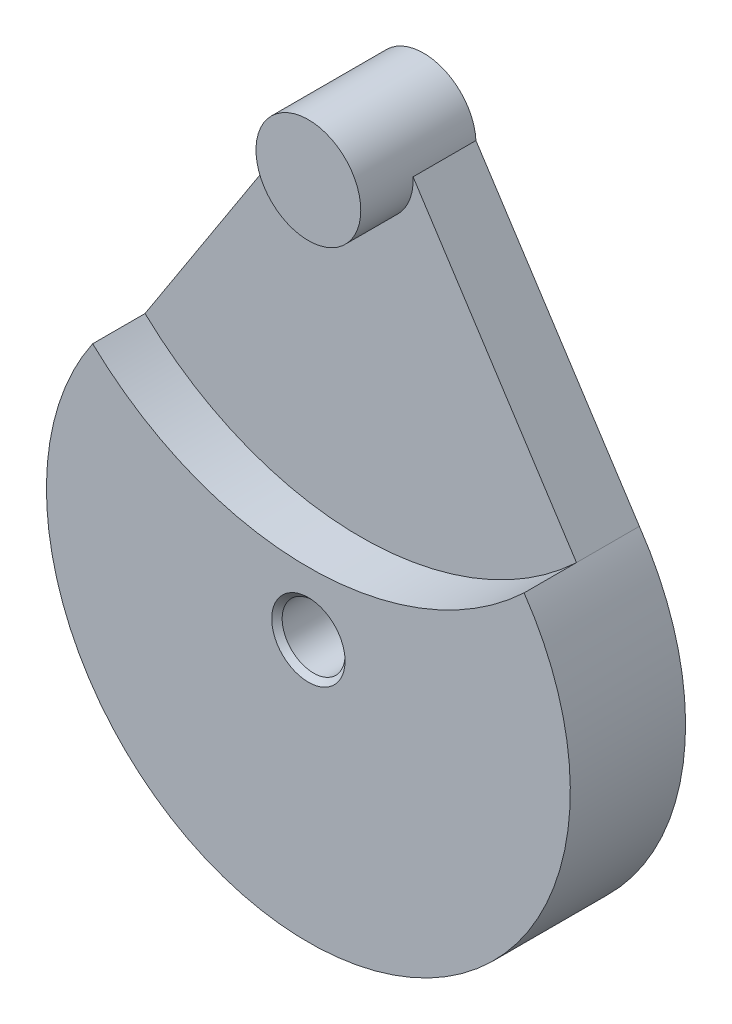
ISO-10303-21;
HEADER;
FILE_DESCRIPTION(('STEP AP214'),'2;1');
FILE_NAME('part.step','',(''),(''),'','','');
FILE_SCHEMA(('AUTOMOTIVE_DESIGN { 1 0 10303 214 1 1 1 1 }'));
ENDSEC;
DATA;
#1=APPLICATION_CONTEXT('core data for automotive mechanical design processes');
#2=APPLICATION_PROTOCOL_DEFINITION('international standard','automotive_design',2000,#1);
#3=PRODUCT_CONTEXT('',#1,'mechanical');
#4=PRODUCT('Part','Part','',(#3));
#5=PRODUCT_RELATED_PRODUCT_CATEGORY('part','',(#4));
#6=PRODUCT_DEFINITION_FORMATION('','',#4);
#7=PRODUCT_DEFINITION_CONTEXT('part definition',#1,'design');
#8=PRODUCT_DEFINITION('design','',#6,#7);
#9=PRODUCT_DEFINITION_SHAPE('','',#8);
#10=(LENGTH_UNIT() NAMED_UNIT(*) SI_UNIT(.MILLI.,.METRE.));
#11=(NAMED_UNIT(*) PLANE_ANGLE_UNIT() SI_UNIT($,.RADIAN.));
#12=(NAMED_UNIT(*) SI_UNIT($,.STERADIAN.) SOLID_ANGLE_UNIT());
#13=UNCERTAINTY_MEASURE_WITH_UNIT(LENGTH_MEASURE(1.E-05),#10,'distance_accuracy_value','');
#14=(GEOMETRIC_REPRESENTATION_CONTEXT(3) GLOBAL_UNCERTAINTY_ASSIGNED_CONTEXT((#13)) GLOBAL_UNIT_ASSIGNED_CONTEXT((#10,
#11,#12)) REPRESENTATION_CONTEXT('',''));
#15=CARTESIAN_POINT('',(0.,0.,0.));
#16=DIRECTION('',(0.,0.,1.));
#17=DIRECTION('',(1.,0.,0.));
#18=AXIS2_PLACEMENT_3D('',#15,#16,#17);
#19=CARTESIAN_POINT('',(0.,0.,6.));
#20=DIRECTION('',(0.,0.,1.));
#21=DIRECTION('',(1.,0.,0.));
#22=AXIS2_PLACEMENT_3D('',#19,#20,#21);
#23=PLANE('',#22);
#24=DIRECTION('',(0.543499344380369,-0.839409591712002,0.));
#25=VECTOR('',#24,1.);
#26=CARTESIAN_POINT('',(20.9767005533225,13.5819546387858,6.));
#27=LINE('',#26,#25);
#28=CARTESIAN_POINT('',(4.99279308600111,38.2683602064009,6.));
#29=VERTEX_POINT('',#28);
#30=CARTESIAN_POINT('',(20.5891195570817,14.1805555555556,6.));
#31=VERTEX_POINT('',#30);
#32=EDGE_CURVE('E81',#29,#31,#27,.T.);
#33=ORIENTED_EDGE('',*,*,#32,.F.);
#34=CARTESIAN_POINT('',(0.,38.,6.));
#35=DIRECTION('',(0.,0.,1.));
#36=DIRECTION('',(1.,0.,0.));
#37=AXIS2_PLACEMENT_3D('',#34,#35,#36);
#38=CIRCLE('',#37,5.);
#39=CARTESIAN_POINT('',(-4.99279304779069,38.2683609172978,6.));
#40=VERTEX_POINT('',#39);
#41=EDGE_CURVE('E122',#40,#29,#38,.T.);
#42=ORIENTED_EDGE('',*,*,#41,.F.);
#43=DIRECTION('',(-0.543499334016566,-0.839409598422337,0.));
#44=VECTOR('',#43,1.);
#45=CARTESIAN_POINT('',(-20.976700713622,13.5819543750109,6.));
#46=LINE('',#45,#44);
#47=CARTESIAN_POINT('',(-20.5891195570817,14.1805555555556,6.));
#48=VERTEX_POINT('',#47);
#49=EDGE_CURVE('E115',#40,#48,#46,.T.);
#50=ORIENTED_EDGE('',*,*,#49,.T.);
#51=CARTESIAN_POINT('',(0.,36.,6.));
#52=DIRECTION('',(0.,0.,-1.));
#53=DIRECTION('',(1.,0.,0.));
#54=AXIS2_PLACEMENT_3D('',#51,#52,#53);
#55=CIRCLE('',#54,30.);
#56=EDGE_CURVE('E108',#31,#48,#55,.T.);
#57=ORIENTED_EDGE('',*,*,#56,.F.);
#58=EDGE_LOOP('',(#33,#42,#50,#57));
#59=FACE_BOUND('',#58,.T.);
#60=ADVANCED_FACE('F35',(#59),#23,.T.);
#61=CARTESIAN_POINT('',(0.,0.,0.));
#62=DIRECTION('',(0.,0.,1.));
#63=DIRECTION('',(1.,0.,0.));
#64=AXIS2_PLACEMENT_3D('',#61,#62,#63);
#65=PLANE('',#64);
#66=CARTESIAN_POINT('',(0.,0.,0.));
#67=DIRECTION('',(0.,0.,1.));
#68=DIRECTION('',(1.,0.,0.));
#69=AXIS2_PLACEMENT_3D('',#66,#67,#68);
#70=CIRCLE('',#69,3.49999999999999);
#71=CARTESIAN_POINT('',(3.49999999999999,0.,0.));
#72=VERTEX_POINT('',#71);
#73=EDGE_CURVE('E126',#72,#72,#70,.T.);
#74=ORIENTED_EDGE('',*,*,#73,.T.);
#75=EDGE_LOOP('',(#74));
#76=FACE_BOUND('',#75,.T.);
#77=CARTESIAN_POINT('',(0.,38.,0.));
#78=DIRECTION('',(0.,0.,1.));
#79=DIRECTION('',(1.,0.,0.));
#80=AXIS2_PLACEMENT_3D('',#77,#78,#79);
#81=CIRCLE('',#80,5.);
#82=CARTESIAN_POINT('',(4.99279308600111,38.2683602064009,0.));
#83=VERTEX_POINT('',#82);
#84=CARTESIAN_POINT('',(-4.99279304779069,38.2683609172978,0.));
#85=VERTEX_POINT('',#84);
#86=EDGE_CURVE('E89',#83,#85,#81,.T.);
#87=ORIENTED_EDGE('',*,*,#86,.F.);
#88=DIRECTION('',(0.543499344380369,-0.839409591712002,0.));
#89=VECTOR('',#88,1.);
#90=CARTESIAN_POINT('',(20.9767005533225,13.5819546387858,0.));
#91=LINE('',#90,#89);
#92=CARTESIAN_POINT('',(20.5891195570817,14.1805555555556,0.));
#93=VERTEX_POINT('',#92);
#94=EDGE_CURVE('E90',#83,#93,#91,.T.);
#95=ORIENTED_EDGE('',*,*,#94,.T.);
#96=CARTESIAN_POINT('',(0.,0.,0.));
#97=DIRECTION('',(0.,0.,1.));
#98=DIRECTION('',(1.,0.,0.));
#99=AXIS2_PLACEMENT_3D('',#96,#97,#98);
#100=CIRCLE('',#99,25.);
#101=CARTESIAN_POINT('',(-20.5891195570817,14.1805555555556,0.));
#102=VERTEX_POINT('',#101);
#103=EDGE_CURVE('E101',#102,#93,#100,.T.);
#104=ORIENTED_EDGE('',*,*,#103,.F.);
#105=DIRECTION('',(-0.543499334016566,-0.839409598422337,0.));
#106=VECTOR('',#105,1.);
#107=CARTESIAN_POINT('',(-20.976700713622,13.5819543750109,0.));
#108=LINE('',#107,#106);
#109=EDGE_CURVE('E151',#85,#102,#108,.T.);
#110=ORIENTED_EDGE('',*,*,#109,.F.);
#111=EDGE_LOOP('',(#87,#95,#104,#110));
#112=FACE_BOUND('',#111,.T.);
#113=ADVANCED_FACE('F144',(#76,#112),#65,.F.);
#114=CARTESIAN_POINT('',(0.,38.,11.));
#115=DIRECTION('',(0.,0.,-1.));
#116=DIRECTION('',(-1.,0.,0.));
#117=AXIS2_PLACEMENT_3D('',#114,#115,#116);
#118=CYLINDRICAL_SURFACE('',#117,5.);
#119=CARTESIAN_POINT('',(0.,38.,11.));
#120=DIRECTION('',(0.,0.,1.));
#121=DIRECTION('',(1.,0.,0.));
#122=AXIS2_PLACEMENT_3D('',#119,#120,#121);
#123=CIRCLE('',#122,5.);
#124=CARTESIAN_POINT('',(5.,38.,11.));
#125=VERTEX_POINT('',#124);
#126=EDGE_CURVE('E123',#125,#125,#123,.T.);
#127=ORIENTED_EDGE('',*,*,#126,.F.);
#128=EDGE_LOOP('',(#127));
#129=FACE_BOUND('',#128,.T.);
#130=ORIENTED_EDGE('',*,*,#41,.T.);
#131=DIRECTION('',(0.,0.,-1.));
#132=VECTOR('',#131,1.);
#133=CARTESIAN_POINT('',(4.99279308600111,38.2683602064009,11.));
#134=LINE('',#133,#132);
#135=EDGE_CURVE('E50',#29,#83,#134,.T.);
#136=ORIENTED_EDGE('',*,*,#135,.T.);
#137=ORIENTED_EDGE('',*,*,#86,.T.);
#138=DIRECTION('',(0.,0.,-1.));
#139=VECTOR('',#138,1.);
#140=CARTESIAN_POINT('',(-4.99279304779069,38.2683609172978,11.));
#141=LINE('',#140,#139);
#142=EDGE_CURVE('E55',#40,#85,#141,.T.);
#143=ORIENTED_EDGE('',*,*,#142,.F.);
#144=EDGE_LOOP('',(#130,#136,#137,#143));
#145=FACE_BOUND('',#144,.T.);
#146=ADVANCED_FACE('F147',(#129,#145),#118,.T.);
#147=CARTESIAN_POINT('',(0.,38.,11.));
#148=DIRECTION('',(0.,0.,1.));
#149=DIRECTION('',(1.,0.,0.));
#150=AXIS2_PLACEMENT_3D('',#147,#148,#149);
#151=PLANE('',#150);
#152=ORIENTED_EDGE('',*,*,#126,.T.);
#153=EDGE_LOOP('',(#152));
#154=FACE_BOUND('',#153,.T.);
#155=ADVANCED_FACE('F178',(#154),#151,.T.);
#156=CARTESIAN_POINT('',(0.,36.,11.));
#157=DIRECTION('',(0.,0.,-1.));
#158=DIRECTION('',(-1.,0.,0.));
#159=AXIS2_PLACEMENT_3D('',#156,#157,#158);
#160=CYLINDRICAL_SURFACE('',#159,30.);
#161=ORIENTED_EDGE('',*,*,#56,.T.);
#162=DIRECTION('',(0.,0.,-1.));
#163=VECTOR('',#162,1.);
#164=CARTESIAN_POINT('',(-20.5891195570817,14.1805555555556,11.));
#165=LINE('',#164,#163);
#166=CARTESIAN_POINT('',(-20.5891195570817,14.1805555555556,11.));
#167=VERTEX_POINT('',#166);
#168=EDGE_CURVE('E111',#167,#48,#165,.T.);
#169=ORIENTED_EDGE('',*,*,#168,.F.);
#170=CARTESIAN_POINT('',(0.,36.,11.));
#171=DIRECTION('',(0.,0.,-1.));
#172=DIRECTION('',(1.,0.,0.));
#173=AXIS2_PLACEMENT_3D('',#170,#171,#172);
#174=CIRCLE('',#173,30.);
#175=CARTESIAN_POINT('',(20.5891195570817,14.1805555555556,11.));
#176=VERTEX_POINT('',#175);
#177=EDGE_CURVE('E110',#176,#167,#174,.T.);
#178=ORIENTED_EDGE('',*,*,#177,.F.);
#179=DIRECTION('',(0.,0.,-1.));
#180=VECTOR('',#179,1.);
#181=CARTESIAN_POINT('',(20.5891195570817,14.1805555555556,11.));
#182=LINE('',#181,#180);
#183=EDGE_CURVE('E97',#176,#31,#182,.T.);
#184=ORIENTED_EDGE('',*,*,#183,.T.);
#185=EDGE_LOOP('',(#161,#169,#178,#184));
#186=FACE_BOUND('',#185,.T.);
#187=ADVANCED_FACE('F106',(#186),#160,.F.);
#188=CARTESIAN_POINT('',(0.,0.,11.));
#189=DIRECTION('',(0.,0.,-1.));
#190=DIRECTION('',(-1.,0.,0.));
#191=AXIS2_PLACEMENT_3D('',#188,#189,#190);
#192=CYLINDRICAL_SURFACE('',#191,25.);
#193=ORIENTED_EDGE('',*,*,#168,.T.);
#194=DIRECTION('',(0.,0.,-1.));
#195=VECTOR('',#194,1.);
#196=CARTESIAN_POINT('',(-20.5891195570817,14.1805555555556,11.));
#197=LINE('',#196,#195);
#198=EDGE_CURVE('E102',#48,#102,#197,.T.);
#199=ORIENTED_EDGE('',*,*,#198,.T.);
#200=ORIENTED_EDGE('',*,*,#103,.T.);
#201=DIRECTION('',(0.,0.,-1.));
#202=VECTOR('',#201,1.);
#203=CARTESIAN_POINT('',(20.5891195570817,14.1805555555556,11.));
#204=LINE('',#203,#202);
#205=EDGE_CURVE('E84',#31,#93,#204,.T.);
#206=ORIENTED_EDGE('',*,*,#205,.F.);
#207=ORIENTED_EDGE('',*,*,#183,.F.);
#208=CARTESIAN_POINT('',(0.,0.,11.));
#209=DIRECTION('',(0.,0.,1.));
#210=DIRECTION('',(1.,0.,0.));
#211=AXIS2_PLACEMENT_3D('',#208,#209,#210);
#212=CIRCLE('',#211,25.);
#213=EDGE_CURVE('E112',#167,#176,#212,.T.);
#214=ORIENTED_EDGE('',*,*,#213,.F.);
#215=EDGE_LOOP('',(#193,#199,#200,#206,#207,#214));
#216=FACE_BOUND('',#215,.T.);
#217=ADVANCED_FACE('F96',(#216),#192,.T.);
#218=CARTESIAN_POINT('',(0.,18.,11.));
#219=DIRECTION('',(0.,0.,1.));
#220=DIRECTION('',(1.,0.,0.));
#221=AXIS2_PLACEMENT_3D('',#218,#219,#220);
#222=PLANE('',#221);
#223=CARTESIAN_POINT('',(0.,0.,11.));
#224=DIRECTION('',(0.,0.,1.));
#225=DIRECTION('',(1.,0.,0.));
#226=AXIS2_PLACEMENT_3D('',#223,#224,#225);
#227=CIRCLE('',#226,3.5);
#228=CARTESIAN_POINT('',(3.5,0.,11.));
#229=VERTEX_POINT('',#228);
#230=EDGE_CURVE('E11',#229,#229,#227,.F.);
#231=ORIENTED_EDGE('',*,*,#230,.T.);
#232=EDGE_LOOP('',(#231));
#233=FACE_BOUND('',#232,.T.);
#234=ORIENTED_EDGE('',*,*,#177,.T.);
#235=ORIENTED_EDGE('',*,*,#213,.T.);
#236=EDGE_LOOP('',(#234,#235));
#237=FACE_BOUND('',#236,.T.);
#238=ADVANCED_FACE('F161',(#233,#237),#222,.T.);
#239=CARTESIAN_POINT('',(0.,0.,0.));
#240=DIRECTION('',(0.,0.,1.));
#241=DIRECTION('',(1.,0.,0.));
#242=AXIS2_PLACEMENT_3D('',#239,#240,#241);
#243=CYLINDRICAL_SURFACE('',#242,3.);
#244=CARTESIAN_POINT('',(0.,0.,0.499999999999992));
#245=DIRECTION('',(0.,0.,1.));
#246=DIRECTION('',(1.,0.,0.));
#247=AXIS2_PLACEMENT_3D('',#244,#245,#246);
#248=CIRCLE('',#247,3.);
#249=CARTESIAN_POINT('',(3.,0.,0.499999999999992));
#250=VERTEX_POINT('',#249);
#251=EDGE_CURVE('E43',#250,#250,#248,.F.);
#252=ORIENTED_EDGE('',*,*,#251,.T.);
#253=EDGE_LOOP('',(#252));
#254=FACE_BOUND('',#253,.T.);
#255=CARTESIAN_POINT('',(0.,0.,10.5));
#256=DIRECTION('',(0.,0.,1.));
#257=DIRECTION('',(1.,0.,0.));
#258=AXIS2_PLACEMENT_3D('',#255,#256,#257);
#259=CIRCLE('',#258,3.);
#260=CARTESIAN_POINT('',(3.,0.,10.5));
#261=VERTEX_POINT('',#260);
#262=EDGE_CURVE('E130',#261,#261,#259,.T.);
#263=ORIENTED_EDGE('',*,*,#262,.T.);
#264=EDGE_LOOP('',(#263));
#265=FACE_BOUND('',#264,.T.);
#266=ADVANCED_FACE('F135',(#254,#265),#243,.F.);
#267=CARTESIAN_POINT('',(20.9767005533225,13.5819546387858,11.));
#268=DIRECTION('',(-0.839409591712002,-0.543499344380369,0.));
#269=DIRECTION('',(0.543499344380369,-0.839409591712002,0.));
#270=AXIS2_PLACEMENT_3D('',#267,#268,#269);
#271=PLANE('',#270);
#272=ORIENTED_EDGE('',*,*,#32,.T.);
#273=ORIENTED_EDGE('',*,*,#205,.T.);
#274=ORIENTED_EDGE('',*,*,#94,.F.);
#275=ORIENTED_EDGE('',*,*,#135,.F.);
#276=EDGE_LOOP('',(#272,#273,#274,#275));
#277=FACE_BOUND('',#276,.T.);
#278=ADVANCED_FACE('F83',(#277),#271,.F.);
#279=CARTESIAN_POINT('',(-20.976700713622,13.5819543750109,11.));
#280=DIRECTION('',(-0.839409598422337,0.543499334016566,0.));
#281=DIRECTION('',(-0.543499334016566,-0.839409598422337,0.));
#282=AXIS2_PLACEMENT_3D('',#279,#280,#281);
#283=PLANE('',#282);
#284=ORIENTED_EDGE('',*,*,#142,.T.);
#285=ORIENTED_EDGE('',*,*,#109,.T.);
#286=ORIENTED_EDGE('',*,*,#198,.F.);
#287=ORIENTED_EDGE('',*,*,#49,.F.);
#288=EDGE_LOOP('',(#284,#285,#286,#287));
#289=FACE_BOUND('',#288,.T.);
#290=ADVANCED_FACE('F141',(#289),#283,.T.);
#291=CARTESIAN_POINT('',(0.,0.,0.));
#292=DIRECTION('',(0.,0.,-1.));
#293=DIRECTION('',(-1.,0.,0.));
#294=AXIS2_PLACEMENT_3D('',#291,#292,#293);
#295=CONICAL_SURFACE('',#294,3.49999999999999,0.785398163397445);
#296=ORIENTED_EDGE('',*,*,#251,.F.);
#297=EDGE_LOOP('',(#296));
#298=FACE_BOUND('',#297,.T.);
#299=ORIENTED_EDGE('',*,*,#73,.F.);
#300=EDGE_LOOP('',(#299));
#301=FACE_BOUND('',#300,.T.);
#302=ADVANCED_FACE('F138',(#298,#301),#295,.F.);
#303=CARTESIAN_POINT('',(0.,0.,10.5));
#304=DIRECTION('',(0.,0.,1.));
#305=DIRECTION('',(1.,0.,0.));
#306=AXIS2_PLACEMENT_3D('',#303,#304,#305);
#307=CONICAL_SURFACE('',#306,3.,0.785398163397444);
#308=ORIENTED_EDGE('',*,*,#230,.F.);
#309=EDGE_LOOP('',(#308));
#310=FACE_BOUND('',#309,.T.);
#311=ORIENTED_EDGE('',*,*,#262,.F.);
#312=EDGE_LOOP('',(#311));
#313=FACE_BOUND('',#312,.T.);
#314=ADVANCED_FACE('F37',(#310,#313),#307,.F.);
#315=CLOSED_SHELL('',(#60,#113,#146,#155,#187,#217,#238,#266,#278,#290,#302,#314));
#316=MANIFOLD_SOLID_BREP('B2',#315);
#317=ADVANCED_BREP_SHAPE_REPRESENTATION('',(#18,#316),#14);
#318=SHAPE_DEFINITION_REPRESENTATION(#9,#317);
ENDSEC;
END-ISO-10303-21;
